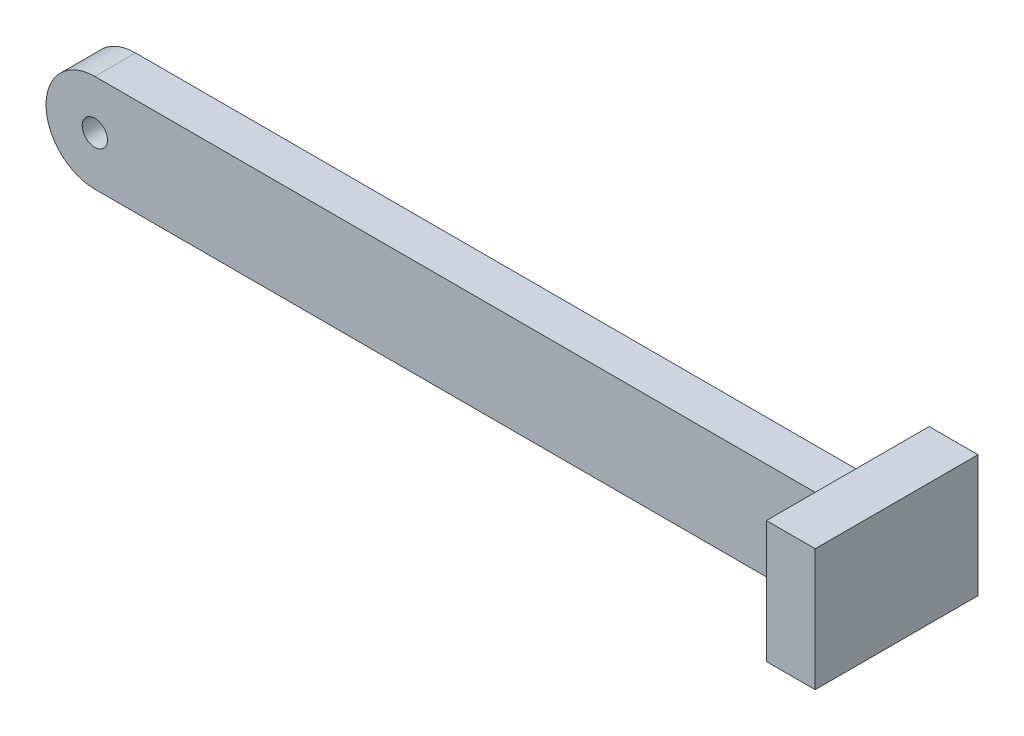
ISO-10303-21;
HEADER;
FILE_DESCRIPTION(('STEP AP214'),'2;1');
FILE_NAME('part.step','',(''),(''),'','','');
FILE_SCHEMA(('AUTOMOTIVE_DESIGN { 1 0 10303 214 1 1 1 1 }'));
ENDSEC;
DATA;
#1=APPLICATION_CONTEXT('core data for automotive mechanical design processes');
#2=APPLICATION_PROTOCOL_DEFINITION('international standard','automotive_design',2000,#1);
#3=PRODUCT_CONTEXT('',#1,'mechanical');
#4=PRODUCT('Part','Part','',(#3));
#5=PRODUCT_RELATED_PRODUCT_CATEGORY('part','',(#4));
#6=PRODUCT_DEFINITION_FORMATION('','',#4);
#7=PRODUCT_DEFINITION_CONTEXT('part definition',#1,'design');
#8=PRODUCT_DEFINITION('design','',#6,#7);
#9=PRODUCT_DEFINITION_SHAPE('','',#8);
#10=(LENGTH_UNIT() NAMED_UNIT(*) SI_UNIT(.MILLI.,.METRE.));
#11=(NAMED_UNIT(*) PLANE_ANGLE_UNIT() SI_UNIT($,.RADIAN.));
#12=(NAMED_UNIT(*) SI_UNIT($,.STERADIAN.) SOLID_ANGLE_UNIT());
#13=UNCERTAINTY_MEASURE_WITH_UNIT(LENGTH_MEASURE(1.E-05),#10,'distance_accuracy_value','');
#14=(GEOMETRIC_REPRESENTATION_CONTEXT(3) GLOBAL_UNCERTAINTY_ASSIGNED_CONTEXT((#13)) GLOBAL_UNIT_ASSIGNED_CONTEXT((#10,
#11,#12)) REPRESENTATION_CONTEXT('',''));
#15=CARTESIAN_POINT('',(0.,0.,0.));
#16=DIRECTION('',(0.,0.,1.));
#17=DIRECTION('',(1.,0.,0.));
#18=AXIS2_PLACEMENT_3D('',#15,#16,#17);
#19=CARTESIAN_POINT('',(0.,-6.,5.));
#20=DIRECTION('',(0.,1.,0.));
#21=DIRECTION('',(-1.,0.,0.));
#22=AXIS2_PLACEMENT_3D('',#19,#20,#21);
#23=PLANE('',#22);
#24=DIRECTION('',(1.,0.,0.));
#25=VECTOR('',#24,1.);
#26=CARTESIAN_POINT('',(0.,-6.,0.));
#27=LINE('',#26,#25);
#28=CARTESIAN_POINT('',(0.,-6.,0.));
#29=VERTEX_POINT('',#28);
#30=CARTESIAN_POINT('',(90.,-6.,0.));
#31=VERTEX_POINT('',#30);
#32=EDGE_CURVE('E188',#29,#31,#27,.T.);
#33=ORIENTED_EDGE('',*,*,#32,.T.);
#34=DIRECTION('',(0.,0.,-1.));
#35=VECTOR('',#34,1.);
#36=CARTESIAN_POINT('',(90.,-6.,5.));
#37=LINE('',#36,#35);
#38=CARTESIAN_POINT('',(90.,-6.,5.));
#39=VERTEX_POINT('',#38);
#40=EDGE_CURVE('E204',#39,#31,#37,.T.);
#41=ORIENTED_EDGE('',*,*,#40,.F.);
#42=DIRECTION('',(1.,0.,0.));
#43=VECTOR('',#42,1.);
#44=CARTESIAN_POINT('',(0.,-6.,5.));
#45=LINE('',#44,#43);
#46=CARTESIAN_POINT('',(0.,-6.,5.));
#47=VERTEX_POINT('',#46);
#48=EDGE_CURVE('E174',#47,#39,#45,.T.);
#49=ORIENTED_EDGE('',*,*,#48,.F.);
#50=DIRECTION('',(0.,0.,-1.));
#51=VECTOR('',#50,1.);
#52=CARTESIAN_POINT('',(0.,-6.,5.));
#53=LINE('',#52,#51);
#54=EDGE_CURVE('E187',#47,#29,#53,.T.);
#55=ORIENTED_EDGE('',*,*,#54,.T.);
#56=EDGE_LOOP('',(#33,#41,#49,#55));
#57=FACE_BOUND('',#56,.T.);
#58=ADVANCED_FACE('F37',(#57),#23,.F.);
#59=CARTESIAN_POINT('',(0.,6.,5.));
#60=DIRECTION('',(0.,1.,0.));
#61=DIRECTION('',(-1.,0.,0.));
#62=AXIS2_PLACEMENT_3D('',#59,#60,#61);
#63=PLANE('',#62);
#64=DIRECTION('',(1.,0.,0.));
#65=VECTOR('',#64,1.);
#66=CARTESIAN_POINT('',(0.,6.,0.));
#67=LINE('',#66,#65);
#68=CARTESIAN_POINT('',(0.,6.,0.));
#69=VERTEX_POINT('',#68);
#70=CARTESIAN_POINT('',(90.,6.,0.));
#71=VERTEX_POINT('',#70);
#72=EDGE_CURVE('E191',#69,#71,#67,.T.);
#73=ORIENTED_EDGE('',*,*,#72,.F.);
#74=DIRECTION('',(0.,0.,-1.));
#75=VECTOR('',#74,1.);
#76=CARTESIAN_POINT('',(0.,6.,5.));
#77=LINE('',#76,#75);
#78=CARTESIAN_POINT('',(0.,6.,5.));
#79=VERTEX_POINT('',#78);
#80=EDGE_CURVE('E200',#79,#69,#77,.T.);
#81=ORIENTED_EDGE('',*,*,#80,.F.);
#82=DIRECTION('',(1.,0.,0.));
#83=VECTOR('',#82,1.);
#84=CARTESIAN_POINT('',(0.,6.,5.));
#85=LINE('',#84,#83);
#86=CARTESIAN_POINT('',(90.,6.,5.));
#87=VERTEX_POINT('',#86);
#88=EDGE_CURVE('E176',#79,#87,#85,.T.);
#89=ORIENTED_EDGE('',*,*,#88,.T.);
#90=DIRECTION('',(0.,0.,-1.));
#91=VECTOR('',#90,1.);
#92=CARTESIAN_POINT('',(90.,6.,5.));
#93=LINE('',#92,#91);
#94=EDGE_CURVE('E202',#87,#71,#93,.T.);
#95=ORIENTED_EDGE('',*,*,#94,.T.);
#96=EDGE_LOOP('',(#73,#81,#89,#95));
#97=FACE_BOUND('',#96,.T.);
#98=ADVANCED_FACE('F227',(#97),#63,.T.);
#99=CARTESIAN_POINT('',(0.,0.,5.));
#100=DIRECTION('',(0.,0.,-1.));
#101=DIRECTION('',(-1.,0.,0.));
#102=AXIS2_PLACEMENT_3D('',#99,#100,#101);
#103=CYLINDRICAL_SURFACE('',#102,1.55);
#104=CARTESIAN_POINT('',(0.,0.,5.));
#105=DIRECTION('',(0.,0.,1.));
#106=DIRECTION('',(1.,0.,0.));
#107=AXIS2_PLACEMENT_3D('',#104,#105,#106);
#108=CIRCLE('',#107,1.55);
#109=CARTESIAN_POINT('',(1.55,0.,5.));
#110=VERTEX_POINT('',#109);
#111=EDGE_CURVE('E182',#110,#110,#108,.T.);
#112=ORIENTED_EDGE('',*,*,#111,.T.);
#113=EDGE_LOOP('',(#112));
#114=FACE_BOUND('',#113,.T.);
#115=CARTESIAN_POINT('',(0.,0.,0.));
#116=DIRECTION('',(0.,0.,1.));
#117=DIRECTION('',(1.,0.,0.));
#118=AXIS2_PLACEMENT_3D('',#115,#116,#117);
#119=CIRCLE('',#118,1.55);
#120=CARTESIAN_POINT('',(1.55,0.,0.));
#121=VERTEX_POINT('',#120);
#122=EDGE_CURVE('E177',#121,#121,#119,.T.);
#123=ORIENTED_EDGE('',*,*,#122,.F.);
#124=EDGE_LOOP('',(#123));
#125=FACE_BOUND('',#124,.T.);
#126=ADVANCED_FACE('F242',(#114,#125),#103,.F.);
#127=CARTESIAN_POINT('',(0.,0.,5.));
#128=DIRECTION('',(0.,0.,-1.));
#129=DIRECTION('',(-1.,0.,0.));
#130=AXIS2_PLACEMENT_3D('',#127,#128,#129);
#131=CYLINDRICAL_SURFACE('',#130,6.);
#132=CARTESIAN_POINT('',(0.,0.,0.));
#133=DIRECTION('',(0.,0.,1.));
#134=DIRECTION('',(1.,0.,0.));
#135=AXIS2_PLACEMENT_3D('',#132,#133,#134);
#136=CIRCLE('',#135,6.);
#137=EDGE_CURVE('E194',#69,#29,#136,.T.);
#138=ORIENTED_EDGE('',*,*,#137,.T.);
#139=ORIENTED_EDGE('',*,*,#54,.F.);
#140=CARTESIAN_POINT('',(0.,0.,5.));
#141=DIRECTION('',(0.,0.,1.));
#142=DIRECTION('',(1.,0.,0.));
#143=AXIS2_PLACEMENT_3D('',#140,#141,#142);
#144=CIRCLE('',#143,6.);
#145=EDGE_CURVE('E180',#79,#47,#144,.T.);
#146=ORIENTED_EDGE('',*,*,#145,.F.);
#147=ORIENTED_EDGE('',*,*,#80,.T.);
#148=EDGE_LOOP('',(#138,#139,#146,#147));
#149=FACE_BOUND('',#148,.T.);
#150=ADVANCED_FACE('F236',(#149),#131,.T.);
#151=CARTESIAN_POINT('',(90.,0.,5.));
#152=DIRECTION('',(0.,0.,-1.));
#153=DIRECTION('',(-1.,0.,0.));
#154=AXIS2_PLACEMENT_3D('',#151,#152,#153);
#155=CYLINDRICAL_SURFACE('',#154,1.5);
#156=DIRECTION('',(0.,0.,-1.));
#157=VECTOR('',#156,1.);
#158=CARTESIAN_POINT('',(90.0000000000001,1.5,5.));
#159=LINE('',#158,#157);
#160=CARTESIAN_POINT('',(90.0000000000001,1.5,5.));
#161=VERTEX_POINT('',#160);
#162=CARTESIAN_POINT('',(90.,1.5,1.));
#163=VERTEX_POINT('',#162);
#164=EDGE_CURVE('E59',#161,#163,#159,.T.);
#165=ORIENTED_EDGE('',*,*,#164,.F.);
#166=CARTESIAN_POINT('',(90.,0.,5.));
#167=DIRECTION('',(0.,0.,1.));
#168=DIRECTION('',(1.,0.,0.));
#169=AXIS2_PLACEMENT_3D('',#166,#167,#168);
#170=CIRCLE('',#169,1.5);
#171=CARTESIAN_POINT('',(90.0000000000001,-1.5,5.));
#172=VERTEX_POINT('',#171);
#173=EDGE_CURVE('E185',#161,#172,#170,.T.);
#174=ORIENTED_EDGE('',*,*,#173,.T.);
#175=DIRECTION('',(0.,0.,-1.));
#176=VECTOR('',#175,1.);
#177=CARTESIAN_POINT('',(90.0000000000001,-1.5,5.));
#178=LINE('',#177,#176);
#179=CARTESIAN_POINT('',(90.,-1.5,1.));
#180=VERTEX_POINT('',#179);
#181=EDGE_CURVE('E171',#180,#172,#178,.F.);
#182=ORIENTED_EDGE('',*,*,#181,.F.);
#183=CARTESIAN_POINT('',(90.,0.,1.));
#184=DIRECTION('',(0.,0.,1.));
#185=DIRECTION('',(1.,0.,0.));
#186=AXIS2_PLACEMENT_3D('',#183,#184,#185);
#187=CIRCLE('',#186,1.5);
#188=EDGE_CURVE('E210',#180,#163,#187,.F.);
#189=ORIENTED_EDGE('',*,*,#188,.T.);
#190=EDGE_LOOP('',(#165,#174,#182,#189));
#191=FACE_BOUND('',#190,.T.);
#192=ADVANCED_FACE('F217',(#191),#155,.F.);
#193=CARTESIAN_POINT('',(0.,0.,5.));
#194=DIRECTION('',(0.,0.,1.));
#195=DIRECTION('',(1.,0.,0.));
#196=AXIS2_PLACEMENT_3D('',#193,#194,#195);
#197=PLANE('',#196);
#198=DIRECTION('',(0.,-1.,0.));
#199=VECTOR('',#198,1.);
#200=CARTESIAN_POINT('',(90.0000000000001,0.,5.));
#201=LINE('',#200,#199);
#202=EDGE_CURVE('E168',#87,#161,#201,.T.);
#203=ORIENTED_EDGE('',*,*,#202,.F.);
#204=ORIENTED_EDGE('',*,*,#88,.F.);
#205=ORIENTED_EDGE('',*,*,#145,.T.);
#206=ORIENTED_EDGE('',*,*,#48,.T.);
#207=EDGE_CURVE('E52',#172,#39,#201,.T.);
#208=ORIENTED_EDGE('',*,*,#207,.F.);
#209=ORIENTED_EDGE('',*,*,#173,.F.);
#210=EDGE_LOOP('',(#203,#204,#205,#206,#208,#209));
#211=FACE_BOUND('',#210,.T.);
#212=ORIENTED_EDGE('',*,*,#111,.F.);
#213=EDGE_LOOP('',(#212));
#214=FACE_BOUND('',#213,.T.);
#215=ADVANCED_FACE('F230',(#211,#214),#197,.T.);
#216=CARTESIAN_POINT('',(0.,0.,0.));
#217=DIRECTION('',(0.,0.,1.));
#218=DIRECTION('',(1.,0.,0.));
#219=AXIS2_PLACEMENT_3D('',#216,#217,#218);
#220=PLANE('',#219);
#221=ORIENTED_EDGE('',*,*,#72,.T.);
#222=DIRECTION('',(0.,-1.,0.));
#223=VECTOR('',#222,1.);
#224=CARTESIAN_POINT('',(90.0000000000001,0.,0.));
#225=LINE('',#224,#223);
#226=CARTESIAN_POINT('',(90.,2.5,0.));
#227=VERTEX_POINT('',#226);
#228=EDGE_CURVE('E160',#71,#227,#225,.T.);
#229=ORIENTED_EDGE('',*,*,#228,.T.);
#230=CARTESIAN_POINT('',(90.,0.,0.));
#231=DIRECTION('',(0.,0.,1.));
#232=DIRECTION('',(1.,0.,0.));
#233=AXIS2_PLACEMENT_3D('',#230,#231,#232);
#234=CIRCLE('',#233,2.5);
#235=CARTESIAN_POINT('',(90.,-2.5,0.));
#236=VERTEX_POINT('',#235);
#237=EDGE_CURVE('E207',#227,#236,#234,.T.);
#238=ORIENTED_EDGE('',*,*,#237,.T.);
#239=EDGE_CURVE('E166',#236,#31,#225,.T.);
#240=ORIENTED_EDGE('',*,*,#239,.T.);
#241=ORIENTED_EDGE('',*,*,#32,.F.);
#242=ORIENTED_EDGE('',*,*,#137,.F.);
#243=EDGE_LOOP('',(#221,#229,#238,#240,#241,#242));
#244=FACE_BOUND('',#243,.T.);
#245=ORIENTED_EDGE('',*,*,#122,.T.);
#246=EDGE_LOOP('',(#245));
#247=FACE_BOUND('',#246,.T.);
#248=ADVANCED_FACE('F221',(#244,#247),#220,.F.);
#249=CARTESIAN_POINT('',(90.,0.,1.));
#250=DIRECTION('',(0.,0.,1.));
#251=DIRECTION('',(1.,0.,0.));
#252=AXIS2_PLACEMENT_3D('',#249,#250,#251);
#253=TOROIDAL_SURFACE('',#252,2.5,1.);
#254=CARTESIAN_POINT('',(90.,-2.5,1.));
#255=DIRECTION('',(-1.,0.,0.));
#256=DIRECTION('',(0.,0.,1.));
#257=AXIS2_PLACEMENT_3D('',#254,#255,#256);
#258=CIRCLE('',#257,1.);
#259=EDGE_CURVE('E11',#236,#180,#258,.F.);
#260=ORIENTED_EDGE('',*,*,#259,.F.);
#261=ORIENTED_EDGE('',*,*,#237,.F.);
#262=CARTESIAN_POINT('',(90.,2.5,1.));
#263=DIRECTION('',(-1.,0.,0.));
#264=DIRECTION('',(0.,0.,1.));
#265=AXIS2_PLACEMENT_3D('',#262,#263,#264);
#266=CIRCLE('',#265,1.);
#267=EDGE_CURVE('E45',#163,#227,#266,.F.);
#268=ORIENTED_EDGE('',*,*,#267,.F.);
#269=ORIENTED_EDGE('',*,*,#188,.F.);
#270=EDGE_LOOP('',(#260,#261,#268,#269));
#271=FACE_BOUND('',#270,.T.);
#272=ADVANCED_FACE('F39',(#271),#253,.T.);
#273=CARTESIAN_POINT('',(90.0000000000001,-7.5,-7.5));
#274=DIRECTION('',(-1.,0.,0.));
#275=DIRECTION('',(0.,0.,1.));
#276=AXIS2_PLACEMENT_3D('',#273,#274,#275);
#277=PLANE('',#276);
#278=ORIENTED_EDGE('',*,*,#181,.T.);
#279=ORIENTED_EDGE('',*,*,#207,.T.);
#280=ORIENTED_EDGE('',*,*,#40,.T.);
#281=ORIENTED_EDGE('',*,*,#239,.F.);
#282=ORIENTED_EDGE('',*,*,#259,.T.);
#283=EDGE_LOOP('',(#278,#279,#280,#281,#282));
#284=FACE_BOUND('',#283,.T.);
#285=ORIENTED_EDGE('',*,*,#94,.F.);
#286=ORIENTED_EDGE('',*,*,#202,.T.);
#287=ORIENTED_EDGE('',*,*,#164,.T.);
#288=ORIENTED_EDGE('',*,*,#267,.T.);
#289=ORIENTED_EDGE('',*,*,#228,.F.);
#290=EDGE_LOOP('',(#285,#286,#287,#288,#289));
#291=FACE_BOUND('',#290,.T.);
#292=DIRECTION('',(0.,-1.,0.));
#293=VECTOR('',#292,1.);
#294=CARTESIAN_POINT('',(90.0000000000001,-7.5,12.5));
#295=LINE('',#294,#293);
#296=CARTESIAN_POINT('',(90.0000000000001,7.5,12.5));
#297=VERTEX_POINT('',#296);
#298=CARTESIAN_POINT('',(90.0000000000001,-7.5,12.5));
#299=VERTEX_POINT('',#298);
#300=EDGE_CURVE('E154',#297,#299,#295,.T.);
#301=ORIENTED_EDGE('',*,*,#300,.F.);
#302=DIRECTION('',(0.,0.,1.));
#303=VECTOR('',#302,1.);
#304=CARTESIAN_POINT('',(90.0000000000001,7.5,-7.5));
#305=LINE('',#304,#303);
#306=CARTESIAN_POINT('',(90.0000000000001,7.5,-7.5));
#307=VERTEX_POINT('',#306);
#308=EDGE_CURVE('E145',#307,#297,#305,.T.);
#309=ORIENTED_EDGE('',*,*,#308,.F.);
#310=DIRECTION('',(0.,-1.,0.));
#311=VECTOR('',#310,1.);
#312=CARTESIAN_POINT('',(90.0000000000001,-7.5,-7.5));
#313=LINE('',#312,#311);
#314=CARTESIAN_POINT('',(90.0000000000001,-7.5,-7.5));
#315=VERTEX_POINT('',#314);
#316=EDGE_CURVE('E139',#307,#315,#313,.T.);
#317=ORIENTED_EDGE('',*,*,#316,.T.);
#318=DIRECTION('',(0.,0.,1.));
#319=VECTOR('',#318,1.);
#320=CARTESIAN_POINT('',(90.0000000000001,-7.5,-7.5));
#321=LINE('',#320,#319);
#322=EDGE_CURVE('E121',#315,#299,#321,.T.);
#323=ORIENTED_EDGE('',*,*,#322,.T.);
#324=EDGE_LOOP('',(#301,#309,#317,#323));
#325=FACE_BOUND('',#324,.T.);
#326=ADVANCED_FACE('F144',(#284,#291,#325),#277,.T.);
#327=CARTESIAN_POINT('',(90.0000000000001,7.5,-7.5));
#328=DIRECTION('',(0.,1.,0.));
#329=DIRECTION('',(-1.,0.,0.));
#330=AXIS2_PLACEMENT_3D('',#327,#328,#329);
#331=PLANE('',#330);
#332=DIRECTION('',(-1.,0.,0.));
#333=VECTOR('',#332,1.);
#334=CARTESIAN_POINT('',(90.0000000000001,7.5,12.5));
#335=LINE('',#334,#333);
#336=CARTESIAN_POINT('',(96.0000000000001,7.5,12.5));
#337=VERTEX_POINT('',#336);
#338=EDGE_CURVE('E146',#337,#297,#335,.T.);
#339=ORIENTED_EDGE('',*,*,#338,.F.);
#340=DIRECTION('',(0.,0.,1.));
#341=VECTOR('',#340,1.);
#342=CARTESIAN_POINT('',(96.0000000000001,7.5,-7.5));
#343=LINE('',#342,#341);
#344=CARTESIAN_POINT('',(96.0000000000001,7.5,-7.5));
#345=VERTEX_POINT('',#344);
#346=EDGE_CURVE('E161',#345,#337,#343,.T.);
#347=ORIENTED_EDGE('',*,*,#346,.F.);
#348=DIRECTION('',(-1.,0.,0.));
#349=VECTOR('',#348,1.);
#350=CARTESIAN_POINT('',(90.0000000000001,7.5,-7.5));
#351=LINE('',#350,#349);
#352=EDGE_CURVE('E132',#345,#307,#351,.T.);
#353=ORIENTED_EDGE('',*,*,#352,.T.);
#354=ORIENTED_EDGE('',*,*,#308,.T.);
#355=EDGE_LOOP('',(#339,#347,#353,#354));
#356=FACE_BOUND('',#355,.T.);
#357=ADVANCED_FACE('F258',(#356),#331,.T.);
#358=CARTESIAN_POINT('',(96.0000000000001,-7.5,-7.5));
#359=DIRECTION('',(1.,0.,0.));
#360=DIRECTION('',(0.,0.,-1.));
#361=AXIS2_PLACEMENT_3D('',#358,#359,#360);
#362=PLANE('',#361);
#363=DIRECTION('',(0.,1.,0.));
#364=VECTOR('',#363,1.);
#365=CARTESIAN_POINT('',(96.0000000000001,-7.5,12.5));
#366=LINE('',#365,#364);
#367=CARTESIAN_POINT('',(96.0000000000001,-7.5,12.5));
#368=VERTEX_POINT('',#367);
#369=EDGE_CURVE('E149',#368,#337,#366,.T.);
#370=ORIENTED_EDGE('',*,*,#369,.F.);
#371=DIRECTION('',(0.,0.,1.));
#372=VECTOR('',#371,1.);
#373=CARTESIAN_POINT('',(96.0000000000001,-7.5,-7.5));
#374=LINE('',#373,#372);
#375=CARTESIAN_POINT('',(96.0000000000001,-7.5,-7.5));
#376=VERTEX_POINT('',#375);
#377=EDGE_CURVE('E131',#376,#368,#374,.T.);
#378=ORIENTED_EDGE('',*,*,#377,.F.);
#379=DIRECTION('',(0.,1.,0.));
#380=VECTOR('',#379,1.);
#381=CARTESIAN_POINT('',(96.0000000000001,-7.5,-7.5));
#382=LINE('',#381,#380);
#383=EDGE_CURVE('E142',#376,#345,#382,.T.);
#384=ORIENTED_EDGE('',*,*,#383,.T.);
#385=ORIENTED_EDGE('',*,*,#346,.T.);
#386=EDGE_LOOP('',(#370,#378,#384,#385));
#387=FACE_BOUND('',#386,.T.);
#388=ADVANCED_FACE('F261',(#387),#362,.T.);
#389=CARTESIAN_POINT('',(90.0000000000001,-7.5,-7.5));
#390=DIRECTION('',(0.,-1.,0.));
#391=DIRECTION('',(0.,0.,-1.));
#392=AXIS2_PLACEMENT_3D('',#389,#390,#391);
#393=PLANE('',#392);
#394=DIRECTION('',(1.,0.,0.));
#395=VECTOR('',#394,1.);
#396=CARTESIAN_POINT('',(90.0000000000001,-7.5,12.5));
#397=LINE('',#396,#395);
#398=EDGE_CURVE('E126',#299,#368,#397,.T.);
#399=ORIENTED_EDGE('',*,*,#398,.F.);
#400=ORIENTED_EDGE('',*,*,#322,.F.);
#401=DIRECTION('',(1.,0.,0.));
#402=VECTOR('',#401,1.);
#403=CARTESIAN_POINT('',(90.0000000000001,-7.5,-7.5));
#404=LINE('',#403,#402);
#405=EDGE_CURVE('E124',#315,#376,#404,.T.);
#406=ORIENTED_EDGE('',*,*,#405,.T.);
#407=ORIENTED_EDGE('',*,*,#377,.T.);
#408=EDGE_LOOP('',(#399,#400,#406,#407));
#409=FACE_BOUND('',#408,.T.);
#410=ADVANCED_FACE('F123',(#409),#393,.T.);
#411=CARTESIAN_POINT('',(0.,0.,-7.5));
#412=DIRECTION('',(0.,0.,-1.));
#413=DIRECTION('',(-1.,0.,0.));
#414=AXIS2_PLACEMENT_3D('',#411,#412,#413);
#415=PLANE('',#414);
#416=ORIENTED_EDGE('',*,*,#316,.F.);
#417=ORIENTED_EDGE('',*,*,#352,.F.);
#418=ORIENTED_EDGE('',*,*,#383,.F.);
#419=ORIENTED_EDGE('',*,*,#405,.F.);
#420=EDGE_LOOP('',(#416,#417,#418,#419));
#421=FACE_BOUND('',#420,.T.);
#422=ADVANCED_FACE('F137',(#421),#415,.T.);
#423=CARTESIAN_POINT('',(0.,0.,12.5));
#424=DIRECTION('',(0.,0.,-1.));
#425=DIRECTION('',(-1.,0.,0.));
#426=AXIS2_PLACEMENT_3D('',#423,#424,#425);
#427=PLANE('',#426);
#428=ORIENTED_EDGE('',*,*,#300,.T.);
#429=ORIENTED_EDGE('',*,*,#398,.T.);
#430=ORIENTED_EDGE('',*,*,#369,.T.);
#431=ORIENTED_EDGE('',*,*,#338,.T.);
#432=EDGE_LOOP('',(#428,#429,#430,#431));
#433=FACE_BOUND('',#432,.T.);
#434=ADVANCED_FACE('F268',(#433),#427,.F.);
#435=CLOSED_SHELL('',(#58,#98,#126,#150,#192,#215,#248,#272,#326,#357,#388,#410,#422,#434));
#436=MANIFOLD_SOLID_BREP('B2',#435);
#437=ADVANCED_BREP_SHAPE_REPRESENTATION('',(#18,#436),#14);
#438=SHAPE_DEFINITION_REPRESENTATION(#9,#437);
ENDSEC;
END-ISO-10303-21;
